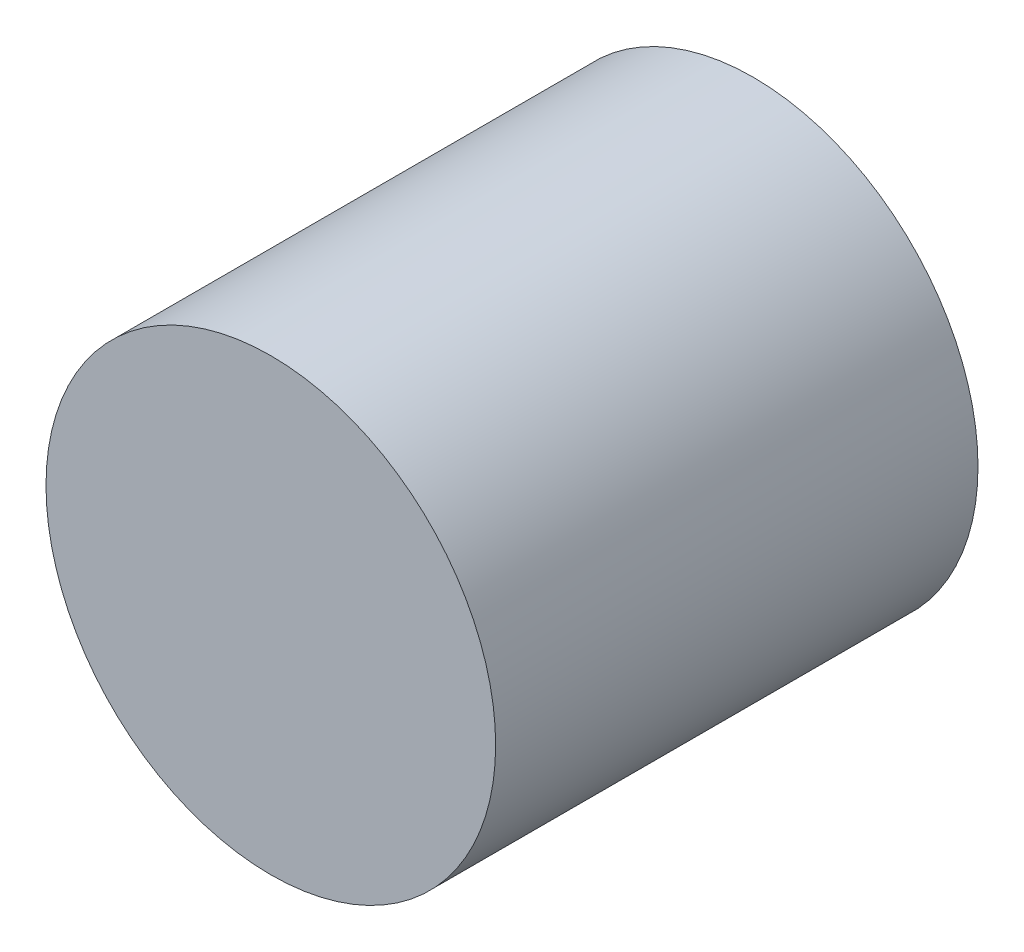
ISO-10303-21;
HEADER;
FILE_DESCRIPTION(('STEP AP214'),'2;1');
FILE_NAME('part.step','',(''),(''),'','','');
FILE_SCHEMA(('AUTOMOTIVE_DESIGN { 1 0 10303 214 1 1 1 1 }'));
ENDSEC;
DATA;
#1=APPLICATION_CONTEXT('core data for automotive mechanical design processes');
#2=APPLICATION_PROTOCOL_DEFINITION('international standard','automotive_design',2000,#1);
#3=PRODUCT_CONTEXT('',#1,'mechanical');
#4=PRODUCT('Part','Part','',(#3));
#5=PRODUCT_RELATED_PRODUCT_CATEGORY('part','',(#4));
#6=PRODUCT_DEFINITION_FORMATION('','',#4);
#7=PRODUCT_DEFINITION_CONTEXT('part definition',#1,'design');
#8=PRODUCT_DEFINITION('design','',#6,#7);
#9=PRODUCT_DEFINITION_SHAPE('','',#8);
#10=(LENGTH_UNIT() NAMED_UNIT(*) SI_UNIT(.MILLI.,.METRE.));
#11=(NAMED_UNIT(*) PLANE_ANGLE_UNIT() SI_UNIT($,.RADIAN.));
#12=(NAMED_UNIT(*) SI_UNIT($,.STERADIAN.) SOLID_ANGLE_UNIT());
#13=UNCERTAINTY_MEASURE_WITH_UNIT(LENGTH_MEASURE(1.E-05),#10,'distance_accuracy_value','');
#14=(GEOMETRIC_REPRESENTATION_CONTEXT(3) GLOBAL_UNCERTAINTY_ASSIGNED_CONTEXT((#13)) GLOBAL_UNIT_ASSIGNED_CONTEXT((#10,
#11,#12)) REPRESENTATION_CONTEXT('',''));
#15=CARTESIAN_POINT('',(0.,0.,0.));
#16=DIRECTION('',(0.,0.,1.));
#17=DIRECTION('',(1.,0.,0.));
#18=AXIS2_PLACEMENT_3D('',#15,#16,#17);
#19=CARTESIAN_POINT('',(-28.51,-27.5,-16.));
#20=DIRECTION('',(0.,0.,-1.));
#21=DIRECTION('',(-1.,0.,0.));
#22=AXIS2_PLACEMENT_3D('',#19,#20,#21);
#23=PLANE('',#22);
#24=CARTESIAN_POINT('',(0.,0.,-16.));
#25=DIRECTION('',(0.,0.,1.));
#26=DIRECTION('',(1.,0.,0.));
#27=AXIS2_PLACEMENT_3D('',#24,#25,#26);
#28=CIRCLE('',#27,27.5);
#29=CARTESIAN_POINT('',(27.5,0.,-16.));
#30=VERTEX_POINT('',#29);
#31=EDGE_CURVE('E45',#30,#30,#28,.T.);
#32=ORIENTED_EDGE('',*,*,#31,.T.);
#33=EDGE_LOOP('',(#32));
#34=FACE_BOUND('',#33,.T.);
#35=ADVANCED_FACE('F41',(#34),#23,.F.);
#36=CARTESIAN_POINT('',(-28.51,27.5,-75.));
#37=DIRECTION('',(0.,0.,1.));
#38=DIRECTION('',(1.,0.,0.));
#39=AXIS2_PLACEMENT_3D('',#36,#37,#38);
#40=PLANE('',#39);
#41=CARTESIAN_POINT('',(0.,0.,-75.));
#42=DIRECTION('',(0.,0.,1.));
#43=DIRECTION('',(1.,0.,0.));
#44=AXIS2_PLACEMENT_3D('',#41,#42,#43);
#45=CIRCLE('',#44,27.5);
#46=CARTESIAN_POINT('',(27.5,0.,-75.));
#47=VERTEX_POINT('',#46);
#48=EDGE_CURVE('E10',#47,#47,#45,.T.);
#49=ORIENTED_EDGE('',*,*,#48,.F.);
#50=EDGE_LOOP('',(#49));
#51=FACE_BOUND('',#50,.T.);
#52=ADVANCED_FACE('F56',(#51),#40,.F.);
#53=CARTESIAN_POINT('',(0.,0.,94.0086439358806));
#54=DIRECTION('',(0.,0.,1.));
#55=DIRECTION('',(1.,0.,0.));
#56=AXIS2_PLACEMENT_3D('',#53,#54,#55);
#57=CYLINDRICAL_SURFACE('',#56,27.5);
#58=ORIENTED_EDGE('',*,*,#31,.F.);
#59=EDGE_LOOP('',(#58));
#60=FACE_BOUND('',#59,.T.);
#61=ORIENTED_EDGE('',*,*,#48,.T.);
#62=EDGE_LOOP('',(#61));
#63=FACE_BOUND('',#62,.T.);
#64=ADVANCED_FACE('F43',(#60,#63),#57,.T.);
#65=CLOSED_SHELL('',(#35,#52,#64));
#66=MANIFOLD_SOLID_BREP('B2',#65);
#67=ADVANCED_BREP_SHAPE_REPRESENTATION('',(#18,#66),#14);
#68=SHAPE_DEFINITION_REPRESENTATION(#9,#67);
ENDSEC;
END-ISO-10303-21;
